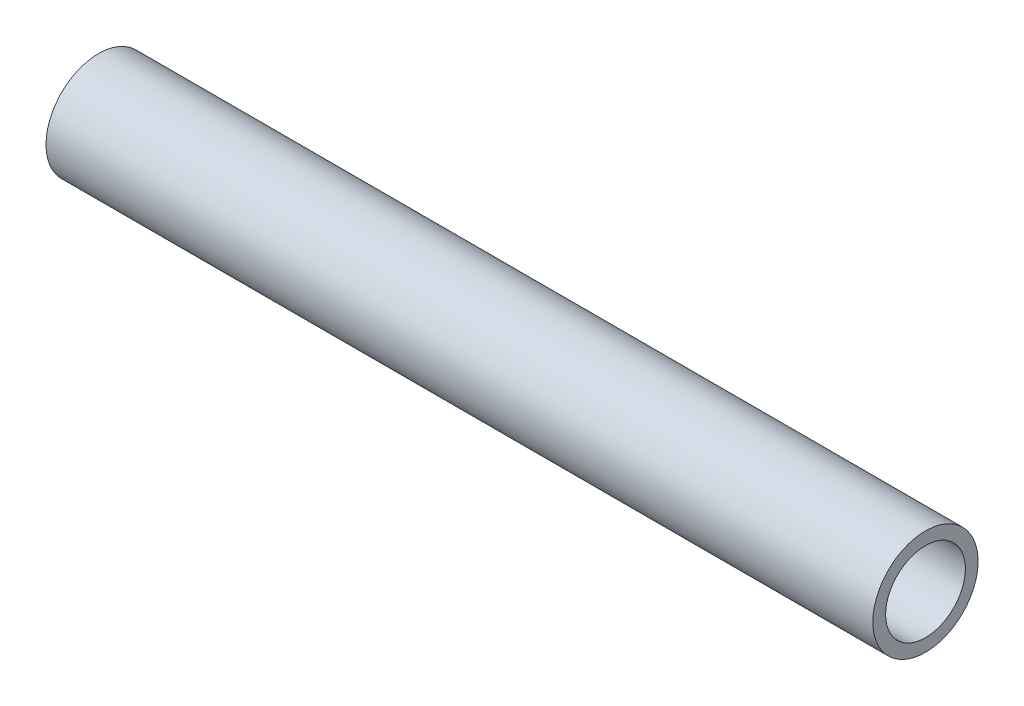
ISO-10303-21;
HEADER;
FILE_DESCRIPTION(('STEP AP214'),'2;1');
FILE_NAME('part.step','',(''),(''),'','','');
FILE_SCHEMA(('AUTOMOTIVE_DESIGN { 1 0 10303 214 1 1 1 1 }'));
ENDSEC;
DATA;
#1=APPLICATION_CONTEXT('core data for automotive mechanical design processes');
#2=APPLICATION_PROTOCOL_DEFINITION('international standard','automotive_design',2000,#1);
#3=PRODUCT_CONTEXT('',#1,'mechanical');
#4=PRODUCT('Part','Part','',(#3));
#5=PRODUCT_RELATED_PRODUCT_CATEGORY('part','',(#4));
#6=PRODUCT_DEFINITION_FORMATION('','',#4);
#7=PRODUCT_DEFINITION_CONTEXT('part definition',#1,'design');
#8=PRODUCT_DEFINITION('design','',#6,#7);
#9=PRODUCT_DEFINITION_SHAPE('','',#8);
#10=(LENGTH_UNIT() NAMED_UNIT(*) SI_UNIT(.MILLI.,.METRE.));
#11=(NAMED_UNIT(*) PLANE_ANGLE_UNIT() SI_UNIT($,.RADIAN.));
#12=(NAMED_UNIT(*) SI_UNIT($,.STERADIAN.) SOLID_ANGLE_UNIT());
#13=UNCERTAINTY_MEASURE_WITH_UNIT(LENGTH_MEASURE(1.E-05),#10,'distance_accuracy_value','');
#14=(GEOMETRIC_REPRESENTATION_CONTEXT(3) GLOBAL_UNCERTAINTY_ASSIGNED_CONTEXT((#13)) GLOBAL_UNIT_ASSIGNED_CONTEXT((#10,
#11,#12)) REPRESENTATION_CONTEXT('',''));
#15=CARTESIAN_POINT('',(0.,0.,0.));
#16=DIRECTION('',(0.,0.,1.));
#17=DIRECTION('',(1.,0.,0.));
#18=AXIS2_PLACEMENT_3D('',#15,#16,#17);
#19=CARTESIAN_POINT('',(0.,0.,0.));
#20=DIRECTION('',(-1.,0.,0.));
#21=DIRECTION('',(0.,0.,1.));
#22=AXIS2_PLACEMENT_3D('',#19,#20,#21);
#23=PLANE('',#22);
#24=CARTESIAN_POINT('',(0.,0.,0.));
#25=DIRECTION('',(-1.,0.,0.));
#26=DIRECTION('',(0.,0.,1.));
#27=AXIS2_PLACEMENT_3D('',#24,#25,#26);
#28=CIRCLE('',#27,7.);
#29=CARTESIAN_POINT('',(0.,0.,7.));
#30=VERTEX_POINT('',#29);
#31=EDGE_CURVE('E53',#30,#30,#28,.T.);
#32=ORIENTED_EDGE('',*,*,#31,.T.);
#33=EDGE_LOOP('',(#32));
#34=FACE_BOUND('',#33,.T.);
#35=CARTESIAN_POINT('',(0.,0.,0.));
#36=DIRECTION('',(-1.,0.,0.));
#37=DIRECTION('',(0.,0.,1.));
#38=AXIS2_PLACEMENT_3D('',#35,#36,#37);
#39=CIRCLE('',#38,5.30572817909523);
#40=CARTESIAN_POINT('',(0.,0.,5.30572817909523));
#41=VERTEX_POINT('',#40);
#42=EDGE_CURVE('E10',#41,#41,#39,.T.);
#43=ORIENTED_EDGE('',*,*,#42,.F.);
#44=EDGE_LOOP('',(#43));
#45=FACE_BOUND('',#44,.T.);
#46=ADVANCED_FACE('F39',(#34,#45),#23,.T.);
#47=CARTESIAN_POINT('',(0.,0.,0.));
#48=DIRECTION('',(-1.,0.,0.));
#49=DIRECTION('',(0.,0.,1.));
#50=AXIS2_PLACEMENT_3D('',#47,#48,#49);
#51=CYLINDRICAL_SURFACE('',#50,5.30572817909523);
#52=CARTESIAN_POINT('',(110.,0.,0.));
#53=DIRECTION('',(-1.,0.,0.));
#54=DIRECTION('',(0.,0.,1.));
#55=AXIS2_PLACEMENT_3D('',#52,#53,#54);
#56=CIRCLE('',#55,5.30572817909523);
#57=CARTESIAN_POINT('',(110.,0.,5.30572817909523));
#58=VERTEX_POINT('',#57);
#59=EDGE_CURVE('E45',#58,#58,#56,.T.);
#60=ORIENTED_EDGE('',*,*,#59,.F.);
#61=EDGE_LOOP('',(#60));
#62=FACE_BOUND('',#61,.T.);
#63=ORIENTED_EDGE('',*,*,#42,.T.);
#64=EDGE_LOOP('',(#63));
#65=FACE_BOUND('',#64,.T.);
#66=ADVANCED_FACE('F69',(#62,#65),#51,.F.);
#67=CARTESIAN_POINT('',(110.,0.,0.));
#68=DIRECTION('',(1.,0.,0.));
#69=DIRECTION('',(0.,0.,-1.));
#70=AXIS2_PLACEMENT_3D('',#67,#68,#69);
#71=PLANE('',#70);
#72=ORIENTED_EDGE('',*,*,#59,.T.);
#73=EDGE_LOOP('',(#72));
#74=FACE_BOUND('',#73,.T.);
#75=CARTESIAN_POINT('',(110.,0.,0.));
#76=DIRECTION('',(-1.,0.,0.));
#77=DIRECTION('',(0.,0.,1.));
#78=AXIS2_PLACEMENT_3D('',#75,#76,#77);
#79=CIRCLE('',#78,7.);
#80=CARTESIAN_POINT('',(110.,0.,7.));
#81=VERTEX_POINT('',#80);
#82=EDGE_CURVE('E49',#81,#81,#79,.T.);
#83=ORIENTED_EDGE('',*,*,#82,.F.);
#84=EDGE_LOOP('',(#83));
#85=FACE_BOUND('',#84,.T.);
#86=ADVANCED_FACE('F63',(#74,#85),#71,.T.);
#87=CARTESIAN_POINT('',(0.,0.,0.));
#88=DIRECTION('',(-1.,0.,0.));
#89=DIRECTION('',(0.,0.,1.));
#90=AXIS2_PLACEMENT_3D('',#87,#88,#89);
#91=CYLINDRICAL_SURFACE('',#90,7.);
#92=ORIENTED_EDGE('',*,*,#82,.T.);
#93=EDGE_LOOP('',(#92));
#94=FACE_BOUND('',#93,.T.);
#95=ORIENTED_EDGE('',*,*,#31,.F.);
#96=EDGE_LOOP('',(#95));
#97=FACE_BOUND('',#96,.T.);
#98=ADVANCED_FACE('F61',(#94,#97),#91,.T.);
#99=CLOSED_SHELL('',(#46,#66,#86,#98));
#100=MANIFOLD_SOLID_BREP('B2',#99);
#101=ADVANCED_BREP_SHAPE_REPRESENTATION('',(#18,#100),#14);
#102=SHAPE_DEFINITION_REPRESENTATION(#9,#101);
ENDSEC;
END-ISO-10303-21;
